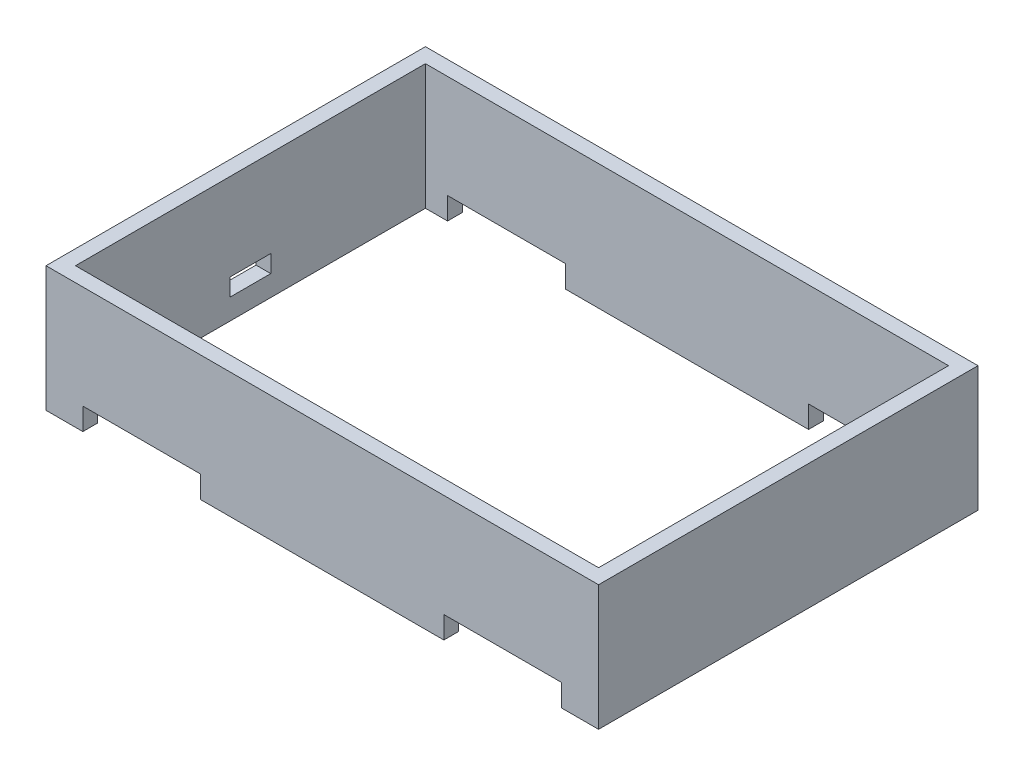
ISO-10303-21;
HEADER;
FILE_DESCRIPTION(('STEP AP214'),'2;1');
FILE_NAME('part.step','',(''),(''),'','','');
FILE_SCHEMA(('AUTOMOTIVE_DESIGN { 1 0 10303 214 1 1 1 1 }'));
ENDSEC;
DATA;
#1=APPLICATION_CONTEXT('core data for automotive mechanical design processes');
#2=APPLICATION_PROTOCOL_DEFINITION('international standard','automotive_design',2000,#1);
#3=PRODUCT_CONTEXT('',#1,'mechanical');
#4=PRODUCT('Part','Part','',(#3));
#5=PRODUCT_RELATED_PRODUCT_CATEGORY('part','',(#4));
#6=PRODUCT_DEFINITION_FORMATION('','',#4);
#7=PRODUCT_DEFINITION_CONTEXT('part definition',#1,'design');
#8=PRODUCT_DEFINITION('design','',#6,#7);
#9=PRODUCT_DEFINITION_SHAPE('','',#8);
#10=(LENGTH_UNIT() NAMED_UNIT(*) SI_UNIT(.MILLI.,.METRE.));
#11=(NAMED_UNIT(*) PLANE_ANGLE_UNIT() SI_UNIT($,.RADIAN.));
#12=(NAMED_UNIT(*) SI_UNIT($,.STERADIAN.) SOLID_ANGLE_UNIT());
#13=UNCERTAINTY_MEASURE_WITH_UNIT(LENGTH_MEASURE(1.E-05),#10,'distance_accuracy_value','');
#14=(GEOMETRIC_REPRESENTATION_CONTEXT(3) GLOBAL_UNCERTAINTY_ASSIGNED_CONTEXT((#13)) GLOBAL_UNIT_ASSIGNED_CONTEXT((#10,
#11,#12)) REPRESENTATION_CONTEXT('',''));
#15=CARTESIAN_POINT('',(0.,0.,0.));
#16=DIRECTION('',(0.,0.,1.));
#17=DIRECTION('',(1.,0.,0.));
#18=AXIS2_PLACEMENT_3D('',#15,#16,#17);
#19=CARTESIAN_POINT('',(0.,0.,0.));
#20=DIRECTION('',(0.,1.,0.));
#21=DIRECTION('',(0.,0.,1.));
#22=AXIS2_PLACEMENT_3D('',#19,#20,#21);
#23=PLANE('',#22);
#24=DIRECTION('',(1.,0.,0.));
#25=VECTOR('',#24,1.);
#26=CARTESIAN_POINT('',(-47.625,0.,32.7025));
#27=LINE('',#26,#25);
#28=CARTESIAN_POINT('',(41.275,0.,32.7025));
#29=VERTEX_POINT('',#28);
#30=CARTESIAN_POINT('',(47.625,0.,32.7025));
#31=VERTEX_POINT('',#30);
#32=EDGE_CURVE('E241',#29,#31,#27,.T.);
#33=ORIENTED_EDGE('',*,*,#32,.F.);
#34=DIRECTION('',(0.,0.,-1.));
#35=VECTOR('',#34,1.);
#36=CARTESIAN_POINT('',(41.275,0.,32.7025));
#37=LINE('',#36,#35);
#38=CARTESIAN_POINT('',(41.275,0.,30.1625));
#39=VERTEX_POINT('',#38);
#40=EDGE_CURVE('E224',#29,#39,#37,.T.);
#41=ORIENTED_EDGE('',*,*,#40,.T.);
#42=DIRECTION('',(-1.,0.,0.));
#43=VECTOR('',#42,1.);
#44=CARTESIAN_POINT('',(45.085,0.,30.1625));
#45=LINE('',#44,#43);
#46=CARTESIAN_POINT('',(45.085,0.,30.1625));
#47=VERTEX_POINT('',#46);
#48=EDGE_CURVE('E281',#47,#39,#45,.T.);
#49=ORIENTED_EDGE('',*,*,#48,.F.);
#50=DIRECTION('',(0.,0.,1.));
#51=VECTOR('',#50,1.);
#52=CARTESIAN_POINT('',(45.085,0.,30.1625));
#53=LINE('',#52,#51);
#54=CARTESIAN_POINT('',(45.085,0.,-30.1625));
#55=VERTEX_POINT('',#54);
#56=EDGE_CURVE('E432',#55,#47,#53,.T.);
#57=ORIENTED_EDGE('',*,*,#56,.F.);
#58=DIRECTION('',(1.,0.,0.));
#59=VECTOR('',#58,1.);
#60=CARTESIAN_POINT('',(45.085,0.,-30.1625));
#61=LINE('',#60,#59);
#62=CARTESIAN_POINT('',(41.275,0.,-30.1625));
#63=VERTEX_POINT('',#62);
#64=EDGE_CURVE('E436',#63,#55,#61,.T.);
#65=ORIENTED_EDGE('',*,*,#64,.F.);
#66=CARTESIAN_POINT('',(41.275,0.,-32.7025));
#67=VERTEX_POINT('',#66);
#68=EDGE_CURVE('E236',#63,#67,#37,.T.);
#69=ORIENTED_EDGE('',*,*,#68,.T.);
#70=DIRECTION('',(-1.,0.,0.));
#71=VECTOR('',#70,1.);
#72=CARTESIAN_POINT('',(-47.625,0.,-32.7025));
#73=LINE('',#72,#71);
#74=CARTESIAN_POINT('',(47.625,0.,-32.7025));
#75=VERTEX_POINT('',#74);
#76=EDGE_CURVE('E261',#75,#67,#73,.T.);
#77=ORIENTED_EDGE('',*,*,#76,.F.);
#78=DIRECTION('',(0.,0.,-1.));
#79=VECTOR('',#78,1.);
#80=CARTESIAN_POINT('',(47.625,0.,-32.7025));
#81=LINE('',#80,#79);
#82=EDGE_CURVE('E252',#31,#75,#81,.T.);
#83=ORIENTED_EDGE('',*,*,#82,.F.);
#84=EDGE_LOOP('',(#33,#41,#49,#57,#65,#69,#77,#83));
#85=FACE_BOUND('',#84,.T.);
#86=ADVANCED_FACE('F38',(#85),#23,.F.);
#87=CARTESIAN_POINT('',(20.955,0.,-32.7025));
#88=VERTEX_POINT('',#87);
#89=CARTESIAN_POINT('',(-20.955,0.,-32.7025));
#90=VERTEX_POINT('',#89);
#91=EDGE_CURVE('E295',#88,#90,#73,.T.);
#92=ORIENTED_EDGE('',*,*,#91,.F.);
#93=DIRECTION('',(0.,0.,-1.));
#94=VECTOR('',#93,1.);
#95=CARTESIAN_POINT('',(20.955,0.,32.7025));
#96=LINE('',#95,#94);
#97=CARTESIAN_POINT('',(20.955,0.,-30.1625));
#98=VERTEX_POINT('',#97);
#99=EDGE_CURVE('E235',#98,#88,#96,.T.);
#100=ORIENTED_EDGE('',*,*,#99,.F.);
#101=CARTESIAN_POINT('',(-20.955,0.,-30.1625));
#102=VERTEX_POINT('',#101);
#103=EDGE_CURVE('E443',#102,#98,#61,.T.);
#104=ORIENTED_EDGE('',*,*,#103,.F.);
#105=DIRECTION('',(0.,0.,-1.));
#106=VECTOR('',#105,1.);
#107=CARTESIAN_POINT('',(-20.955,0.,32.7025));
#108=LINE('',#107,#106);
#109=EDGE_CURVE('E342',#102,#90,#108,.T.);
#110=ORIENTED_EDGE('',*,*,#109,.T.);
#111=EDGE_LOOP('',(#92,#100,#104,#110));
#112=FACE_BOUND('',#111,.T.);
#113=ADVANCED_FACE('F570',(#112),#23,.F.);
#114=CARTESIAN_POINT('',(20.955,0.,30.1625));
#115=VERTEX_POINT('',#114);
#116=CARTESIAN_POINT('',(-20.955,0.,30.1625));
#117=VERTEX_POINT('',#116);
#118=EDGE_CURVE('E486',#115,#117,#45,.T.);
#119=ORIENTED_EDGE('',*,*,#118,.F.);
#120=CARTESIAN_POINT('',(20.955,0.,32.7025));
#121=VERTEX_POINT('',#120);
#122=EDGE_CURVE('E503',#121,#115,#96,.T.);
#123=ORIENTED_EDGE('',*,*,#122,.F.);
#124=CARTESIAN_POINT('',(-20.955,0.,32.7025));
#125=VERTEX_POINT('',#124);
#126=EDGE_CURVE('E254',#125,#121,#27,.T.);
#127=ORIENTED_EDGE('',*,*,#126,.F.);
#128=EDGE_CURVE('E336',#125,#117,#108,.T.);
#129=ORIENTED_EDGE('',*,*,#128,.T.);
#130=EDGE_LOOP('',(#119,#123,#127,#129));
#131=FACE_BOUND('',#130,.T.);
#132=ADVANCED_FACE('F595',(#131),#23,.F.);
#133=CARTESIAN_POINT('',(47.625,21.59,-32.7025));
#134=DIRECTION('',(-1.,0.,0.));
#135=DIRECTION('',(0.,0.,1.));
#136=AXIS2_PLACEMENT_3D('',#133,#134,#135);
#137=PLANE('',#136);
#138=ORIENTED_EDGE('',*,*,#82,.T.);
#139=DIRECTION('',(0.,-1.,0.));
#140=VECTOR('',#139,1.);
#141=CARTESIAN_POINT('',(47.625,21.59,-32.7025));
#142=LINE('',#141,#140);
#143=CARTESIAN_POINT('',(47.625,21.59,-32.7025));
#144=VERTEX_POINT('',#143);
#145=EDGE_CURVE('E318',#144,#75,#142,.T.);
#146=ORIENTED_EDGE('',*,*,#145,.F.);
#147=DIRECTION('',(0.,0.,-1.));
#148=VECTOR('',#147,1.);
#149=CARTESIAN_POINT('',(47.625,21.59,-32.7025));
#150=LINE('',#149,#148);
#151=CARTESIAN_POINT('',(47.625,21.59,32.7025));
#152=VERTEX_POINT('',#151);
#153=EDGE_CURVE('E266',#152,#144,#150,.T.);
#154=ORIENTED_EDGE('',*,*,#153,.F.);
#155=DIRECTION('',(0.,-1.,0.));
#156=VECTOR('',#155,1.);
#157=CARTESIAN_POINT('',(47.625,21.59,32.7025));
#158=LINE('',#157,#156);
#159=EDGE_CURVE('E289',#152,#31,#158,.T.);
#160=ORIENTED_EDGE('',*,*,#159,.T.);
#161=EDGE_LOOP('',(#138,#146,#154,#160));
#162=FACE_BOUND('',#161,.T.);
#163=ADVANCED_FACE('F40',(#162),#137,.F.);
#164=CARTESIAN_POINT('',(-47.625,21.59,-32.7025));
#165=DIRECTION('',(0.,0.,1.));
#166=DIRECTION('',(1.,0.,0.));
#167=AXIS2_PLACEMENT_3D('',#164,#165,#166);
#168=PLANE('',#167);
#169=ORIENTED_EDGE('',*,*,#76,.T.);
#170=DIRECTION('',(0.,1.,0.));
#171=VECTOR('',#170,1.);
#172=CARTESIAN_POINT('',(41.275,21.59,-32.7025));
#173=LINE('',#172,#171);
#174=CARTESIAN_POINT('',(41.275,3.81,-32.7025));
#175=VERTEX_POINT('',#174);
#176=EDGE_CURVE('E385',#67,#175,#173,.T.);
#177=ORIENTED_EDGE('',*,*,#176,.T.);
#178=DIRECTION('',(-1.,0.,0.));
#179=VECTOR('',#178,1.);
#180=CARTESIAN_POINT('',(-47.625,3.81000000000002,-32.7025));
#181=LINE('',#180,#179);
#182=CARTESIAN_POINT('',(20.955,3.81000000000001,-32.7025));
#183=VERTEX_POINT('',#182);
#184=EDGE_CURVE('E377',#175,#183,#181,.T.);
#185=ORIENTED_EDGE('',*,*,#184,.T.);
#186=DIRECTION('',(0.,-1.,0.));
#187=VECTOR('',#186,1.);
#188=CARTESIAN_POINT('',(20.955,21.59,-32.7025));
#189=LINE('',#188,#187);
#190=EDGE_CURVE('E369',#183,#88,#189,.T.);
#191=ORIENTED_EDGE('',*,*,#190,.T.);
#192=ORIENTED_EDGE('',*,*,#91,.T.);
#193=DIRECTION('',(0.,1.,0.));
#194=VECTOR('',#193,1.);
#195=CARTESIAN_POINT('',(-20.955,21.59,-32.7025));
#196=LINE('',#195,#194);
#197=CARTESIAN_POINT('',(-20.955,3.81,-32.7025));
#198=VERTEX_POINT('',#197);
#199=EDGE_CURVE('E361',#90,#198,#196,.T.);
#200=ORIENTED_EDGE('',*,*,#199,.T.);
#201=DIRECTION('',(-1.,0.,0.));
#202=VECTOR('',#201,1.);
#203=CARTESIAN_POINT('',(-47.625,3.81000000000001,-32.7025));
#204=LINE('',#203,#202);
#205=CARTESIAN_POINT('',(-41.275,3.81000000000001,-32.7025));
#206=VERTEX_POINT('',#205);
#207=EDGE_CURVE('E354',#198,#206,#204,.T.);
#208=ORIENTED_EDGE('',*,*,#207,.T.);
#209=DIRECTION('',(0.,-1.,0.));
#210=VECTOR('',#209,1.);
#211=CARTESIAN_POINT('',(-41.275,21.59,-32.7025));
#212=LINE('',#211,#210);
#213=CARTESIAN_POINT('',(-41.275,0.,-32.7025));
#214=VERTEX_POINT('',#213);
#215=EDGE_CURVE('E310',#206,#214,#212,.T.);
#216=ORIENTED_EDGE('',*,*,#215,.T.);
#217=CARTESIAN_POINT('',(-47.625,0.,-32.7025));
#218=VERTEX_POINT('',#217);
#219=EDGE_CURVE('E292',#214,#218,#73,.T.);
#220=ORIENTED_EDGE('',*,*,#219,.T.);
#221=DIRECTION('',(0.,-1.,0.));
#222=VECTOR('',#221,1.);
#223=CARTESIAN_POINT('',(-47.625,21.59,-32.7025));
#224=LINE('',#223,#222);
#225=CARTESIAN_POINT('',(-47.625,21.59,-32.7025));
#226=VERTEX_POINT('',#225);
#227=EDGE_CURVE('E307',#226,#218,#224,.T.);
#228=ORIENTED_EDGE('',*,*,#227,.F.);
#229=DIRECTION('',(-1.,0.,0.));
#230=VECTOR('',#229,1.);
#231=CARTESIAN_POINT('',(-47.625,21.59,-32.7025));
#232=LINE('',#231,#230);
#233=EDGE_CURVE('E272',#144,#226,#232,.T.);
#234=ORIENTED_EDGE('',*,*,#233,.F.);
#235=ORIENTED_EDGE('',*,*,#145,.T.);
#236=EDGE_LOOP('',(#169,#177,#185,#191,#192,#200,#208,#216,#220,#228,#234,#235));
#237=FACE_BOUND('',#236,.T.);
#238=ADVANCED_FACE('F306',(#237),#168,.F.);
#239=CARTESIAN_POINT('',(-47.625,21.59,-32.7025));
#240=DIRECTION('',(1.,0.,0.));
#241=DIRECTION('',(0.,0.,-1.));
#242=AXIS2_PLACEMENT_3D('',#239,#240,#241);
#243=PLANE('',#242);
#244=DIRECTION('',(0.,0.,1.));
#245=VECTOR('',#244,1.);
#246=CARTESIAN_POINT('',(-47.625,3.58,3.50000000000001));
#247=LINE('',#246,#245);
#248=CARTESIAN_POINT('',(-47.625,3.58,-3.49999999999999));
#249=VERTEX_POINT('',#248);
#250=CARTESIAN_POINT('',(-47.625,3.58,3.50000000000001));
#251=VERTEX_POINT('',#250);
#252=EDGE_CURVE('E402',#249,#251,#247,.T.);
#253=ORIENTED_EDGE('',*,*,#252,.F.);
#254=DIRECTION('',(0.,-1.,0.));
#255=VECTOR('',#254,1.);
#256=CARTESIAN_POINT('',(-47.625,3.58,-3.49999999999999));
#257=LINE('',#256,#255);
#258=CARTESIAN_POINT('',(-47.625,6.58,-3.49999999999999));
#259=VERTEX_POINT('',#258);
#260=EDGE_CURVE('E399',#259,#249,#257,.T.);
#261=ORIENTED_EDGE('',*,*,#260,.F.);
#262=DIRECTION('',(0.,0.,-1.));
#263=VECTOR('',#262,1.);
#264=CARTESIAN_POINT('',(-47.625,6.58,3.50000000000001));
#265=LINE('',#264,#263);
#266=CARTESIAN_POINT('',(-47.625,6.58,3.50000000000001));
#267=VERTEX_POINT('',#266);
#268=EDGE_CURVE('E410',#267,#259,#265,.T.);
#269=ORIENTED_EDGE('',*,*,#268,.F.);
#270=DIRECTION('',(0.,1.,0.));
#271=VECTOR('',#270,1.);
#272=CARTESIAN_POINT('',(-47.625,3.58,3.50000000000001));
#273=LINE('',#272,#271);
#274=EDGE_CURVE('E406',#251,#267,#273,.T.);
#275=ORIENTED_EDGE('',*,*,#274,.F.);
#276=EDGE_LOOP('',(#253,#261,#269,#275));
#277=FACE_BOUND('',#276,.T.);
#278=DIRECTION('',(0.,0.,1.));
#279=VECTOR('',#278,1.);
#280=CARTESIAN_POINT('',(-47.625,0.,-32.7025));
#281=LINE('',#280,#279);
#282=CARTESIAN_POINT('',(-47.625,0.,32.7025));
#283=VERTEX_POINT('',#282);
#284=EDGE_CURVE('E255',#218,#283,#281,.T.);
#285=ORIENTED_EDGE('',*,*,#284,.T.);
#286=DIRECTION('',(0.,-1.,0.));
#287=VECTOR('',#286,1.);
#288=CARTESIAN_POINT('',(-47.625,21.59,32.7025));
#289=LINE('',#288,#287);
#290=CARTESIAN_POINT('',(-47.625,21.59,32.7025));
#291=VERTEX_POINT('',#290);
#292=EDGE_CURVE('E319',#291,#283,#289,.T.);
#293=ORIENTED_EDGE('',*,*,#292,.F.);
#294=DIRECTION('',(0.,0.,1.));
#295=VECTOR('',#294,1.);
#296=CARTESIAN_POINT('',(-47.625,21.59,-32.7025));
#297=LINE('',#296,#295);
#298=EDGE_CURVE('E278',#226,#291,#297,.T.);
#299=ORIENTED_EDGE('',*,*,#298,.F.);
#300=ORIENTED_EDGE('',*,*,#227,.T.);
#301=EDGE_LOOP('',(#285,#293,#299,#300));
#302=FACE_BOUND('',#301,.T.);
#303=ADVANCED_FACE('F315',(#277,#302),#243,.F.);
#304=CARTESIAN_POINT('',(-47.625,21.59,32.7025));
#305=DIRECTION('',(0.,0.,-1.));
#306=DIRECTION('',(-1.,0.,0.));
#307=AXIS2_PLACEMENT_3D('',#304,#305,#306);
#308=PLANE('',#307);
#309=DIRECTION('',(1.,0.,0.));
#310=VECTOR('',#309,1.);
#311=CARTESIAN_POINT('',(20.955,3.81000000000001,32.7025));
#312=LINE('',#311,#310);
#313=CARTESIAN_POINT('',(20.955,3.81000000000001,32.7025));
#314=VERTEX_POINT('',#313);
#315=CARTESIAN_POINT('',(41.275,3.81,32.7025));
#316=VERTEX_POINT('',#315);
#317=EDGE_CURVE('E245',#314,#316,#312,.T.);
#318=ORIENTED_EDGE('',*,*,#317,.T.);
#319=DIRECTION('',(0.,-1.,0.));
#320=VECTOR('',#319,1.);
#321=CARTESIAN_POINT('',(41.275,0.,32.7025));
#322=LINE('',#321,#320);
#323=EDGE_CURVE('E228',#316,#29,#322,.T.);
#324=ORIENTED_EDGE('',*,*,#323,.T.);
#325=ORIENTED_EDGE('',*,*,#32,.T.);
#326=ORIENTED_EDGE('',*,*,#159,.F.);
#327=DIRECTION('',(1.,0.,0.));
#328=VECTOR('',#327,1.);
#329=CARTESIAN_POINT('',(-47.625,21.59,32.7025));
#330=LINE('',#329,#328);
#331=EDGE_CURVE('E286',#291,#152,#330,.T.);
#332=ORIENTED_EDGE('',*,*,#331,.F.);
#333=ORIENTED_EDGE('',*,*,#292,.T.);
#334=CARTESIAN_POINT('',(-41.275,0.,32.7025));
#335=VERTEX_POINT('',#334);
#336=EDGE_CURVE('E257',#283,#335,#27,.T.);
#337=ORIENTED_EDGE('',*,*,#336,.T.);
#338=DIRECTION('',(0.,1.,0.));
#339=VECTOR('',#338,1.);
#340=CARTESIAN_POINT('',(-41.275,0.,32.7025));
#341=LINE('',#340,#339);
#342=CARTESIAN_POINT('',(-41.275,3.81000000000001,32.7025));
#343=VERTEX_POINT('',#342);
#344=EDGE_CURVE('E509',#335,#343,#341,.T.);
#345=ORIENTED_EDGE('',*,*,#344,.T.);
#346=DIRECTION('',(1.,0.,0.));
#347=VECTOR('',#346,1.);
#348=CARTESIAN_POINT('',(-41.275,3.81000000000001,32.7025));
#349=LINE('',#348,#347);
#350=CARTESIAN_POINT('',(-20.955,3.81,32.7025));
#351=VERTEX_POINT('',#350);
#352=EDGE_CURVE('E512',#343,#351,#349,.T.);
#353=ORIENTED_EDGE('',*,*,#352,.T.);
#354=DIRECTION('',(0.,-1.,0.));
#355=VECTOR('',#354,1.);
#356=CARTESIAN_POINT('',(-20.955,0.,32.7025));
#357=LINE('',#356,#355);
#358=EDGE_CURVE('E505',#351,#125,#357,.T.);
#359=ORIENTED_EDGE('',*,*,#358,.T.);
#360=ORIENTED_EDGE('',*,*,#126,.T.);
#361=DIRECTION('',(0.,1.,0.));
#362=VECTOR('',#361,1.);
#363=CARTESIAN_POINT('',(20.955,0.,32.7025));
#364=LINE('',#363,#362);
#365=EDGE_CURVE('E247',#121,#314,#364,.T.);
#366=ORIENTED_EDGE('',*,*,#365,.T.);
#367=EDGE_LOOP('',(#318,#324,#325,#326,#332,#333,#337,#345,#353,#359,#360,#366));
#368=FACE_BOUND('',#367,.T.);
#369=ADVANCED_FACE('F239',(#368),#308,.F.);
#370=CARTESIAN_POINT('',(0.,21.59,0.));
#371=DIRECTION('',(0.,1.,0.));
#372=DIRECTION('',(0.,0.,1.));
#373=AXIS2_PLACEMENT_3D('',#370,#371,#372);
#374=PLANE('',#373);
#375=DIRECTION('',(0.,0.,1.));
#376=VECTOR('',#375,1.);
#377=CARTESIAN_POINT('',(-45.085,21.59,30.1625));
#378=LINE('',#377,#376);
#379=CARTESIAN_POINT('',(-45.085,21.59,-30.1625));
#380=VERTEX_POINT('',#379);
#381=CARTESIAN_POINT('',(-45.085,21.59,30.1625));
#382=VERTEX_POINT('',#381);
#383=EDGE_CURVE('E431',#380,#382,#378,.T.);
#384=ORIENTED_EDGE('',*,*,#383,.F.);
#385=DIRECTION('',(-1.,0.,0.));
#386=VECTOR('',#385,1.);
#387=CARTESIAN_POINT('',(45.085,21.59,-30.1625));
#388=LINE('',#387,#386);
#389=CARTESIAN_POINT('',(45.085,21.59,-30.1625));
#390=VERTEX_POINT('',#389);
#391=EDGE_CURVE('E456',#390,#380,#388,.T.);
#392=ORIENTED_EDGE('',*,*,#391,.F.);
#393=DIRECTION('',(0.,0.,-1.));
#394=VECTOR('',#393,1.);
#395=CARTESIAN_POINT('',(45.085,21.59,30.1625));
#396=LINE('',#395,#394);
#397=CARTESIAN_POINT('',(45.085,21.59,30.1625));
#398=VERTEX_POINT('',#397);
#399=EDGE_CURVE('E452',#398,#390,#396,.T.);
#400=ORIENTED_EDGE('',*,*,#399,.F.);
#401=DIRECTION('',(1.,0.,0.));
#402=VECTOR('',#401,1.);
#403=CARTESIAN_POINT('',(45.085,21.59,30.1625));
#404=LINE('',#403,#402);
#405=EDGE_CURVE('E448',#382,#398,#404,.T.);
#406=ORIENTED_EDGE('',*,*,#405,.F.);
#407=EDGE_LOOP('',(#384,#392,#400,#406));
#408=FACE_BOUND('',#407,.T.);
#409=ORIENTED_EDGE('',*,*,#153,.T.);
#410=ORIENTED_EDGE('',*,*,#233,.T.);
#411=ORIENTED_EDGE('',*,*,#298,.T.);
#412=ORIENTED_EDGE('',*,*,#331,.T.);
#413=EDGE_LOOP('',(#409,#410,#411,#412));
#414=FACE_BOUND('',#413,.T.);
#415=ADVANCED_FACE('F478',(#408,#414),#374,.T.);
#416=ORIENTED_EDGE('',*,*,#219,.F.);
#417=DIRECTION('',(0.,0.,-1.));
#418=VECTOR('',#417,1.);
#419=CARTESIAN_POINT('',(-41.275,0.,32.7025));
#420=LINE('',#419,#418);
#421=CARTESIAN_POINT('',(-41.275,0.,-30.1625));
#422=VERTEX_POINT('',#421);
#423=EDGE_CURVE('E330',#422,#214,#420,.T.);
#424=ORIENTED_EDGE('',*,*,#423,.F.);
#425=CARTESIAN_POINT('',(-45.085,0.,-30.1625));
#426=VERTEX_POINT('',#425);
#427=EDGE_CURVE('E438',#426,#422,#61,.T.);
#428=ORIENTED_EDGE('',*,*,#427,.F.);
#429=DIRECTION('',(0.,0.,-1.));
#430=VECTOR('',#429,1.);
#431=CARTESIAN_POINT('',(-45.085,0.,30.1625));
#432=LINE('',#431,#430);
#433=CARTESIAN_POINT('',(-45.085,0.,30.1625));
#434=VERTEX_POINT('',#433);
#435=EDGE_CURVE('E442',#434,#426,#432,.T.);
#436=ORIENTED_EDGE('',*,*,#435,.F.);
#437=CARTESIAN_POINT('',(-41.275,0.,30.1625));
#438=VERTEX_POINT('',#437);
#439=EDGE_CURVE('E326',#438,#434,#45,.T.);
#440=ORIENTED_EDGE('',*,*,#439,.F.);
#441=EDGE_CURVE('E324',#335,#438,#420,.T.);
#442=ORIENTED_EDGE('',*,*,#441,.F.);
#443=ORIENTED_EDGE('',*,*,#336,.F.);
#444=ORIENTED_EDGE('',*,*,#284,.F.);
#445=EDGE_LOOP('',(#416,#424,#428,#436,#440,#442,#443,#444));
#446=FACE_BOUND('',#445,.T.);
#447=ADVANCED_FACE('F321',(#446),#23,.F.);
#448=CARTESIAN_POINT('',(-45.085,-108.48840733,30.1625));
#449=DIRECTION('',(-1.,0.,0.));
#450=DIRECTION('',(0.,0.,1.));
#451=AXIS2_PLACEMENT_3D('',#448,#449,#450);
#452=PLANE('',#451);
#453=DIRECTION('',(0.,0.,1.));
#454=VECTOR('',#453,1.);
#455=CARTESIAN_POINT('',(-45.085,6.58,3.49999999999998));
#456=LINE('',#455,#454);
#457=CARTESIAN_POINT('',(-45.085,6.58,-3.49999999999999));
#458=VERTEX_POINT('',#457);
#459=CARTESIAN_POINT('',(-45.085,6.58,3.50000000000001));
#460=VERTEX_POINT('',#459);
#461=EDGE_CURVE('E391',#458,#460,#456,.T.);
#462=ORIENTED_EDGE('',*,*,#461,.F.);
#463=DIRECTION('',(0.,1.,0.));
#464=VECTOR('',#463,1.);
#465=CARTESIAN_POINT('',(-45.085,3.58,-3.49999999999999));
#466=LINE('',#465,#464);
#467=CARTESIAN_POINT('',(-45.085,3.58,-3.5));
#468=VERTEX_POINT('',#467);
#469=EDGE_CURVE('E395',#468,#458,#466,.T.);
#470=ORIENTED_EDGE('',*,*,#469,.F.);
#471=DIRECTION('',(0.,0.,-1.));
#472=VECTOR('',#471,1.);
#473=CARTESIAN_POINT('',(-45.085,3.58,3.49999999999998));
#474=LINE('',#473,#472);
#475=CARTESIAN_POINT('',(-45.085,3.58,3.50000000000001));
#476=VERTEX_POINT('',#475);
#477=EDGE_CURVE('E418',#476,#468,#474,.T.);
#478=ORIENTED_EDGE('',*,*,#477,.F.);
#479=DIRECTION('',(0.,-1.,0.));
#480=VECTOR('',#479,1.);
#481=CARTESIAN_POINT('',(-45.085,3.58,3.50000000000001));
#482=LINE('',#481,#480);
#483=EDGE_CURVE('E388',#460,#476,#482,.T.);
#484=ORIENTED_EDGE('',*,*,#483,.F.);
#485=EDGE_LOOP('',(#462,#470,#478,#484));
#486=FACE_BOUND('',#485,.T.);
#487=ORIENTED_EDGE('',*,*,#435,.T.);
#488=DIRECTION('',(0.,1.,0.));
#489=VECTOR('',#488,1.);
#490=CARTESIAN_POINT('',(-45.085,-108.48840733,-30.1625));
#491=LINE('',#490,#489);
#492=EDGE_CURVE('E437',#426,#380,#491,.T.);
#493=ORIENTED_EDGE('',*,*,#492,.T.);
#494=ORIENTED_EDGE('',*,*,#383,.T.);
#495=DIRECTION('',(0.,1.,0.));
#496=VECTOR('',#495,1.);
#497=CARTESIAN_POINT('',(-45.085,-108.48840733,30.1625));
#498=LINE('',#497,#496);
#499=EDGE_CURVE('E460',#434,#382,#498,.T.);
#500=ORIENTED_EDGE('',*,*,#499,.F.);
#501=EDGE_LOOP('',(#487,#493,#494,#500));
#502=FACE_BOUND('',#501,.T.);
#503=ADVANCED_FACE('F599',(#486,#502),#452,.F.);
#504=CARTESIAN_POINT('',(45.085,-108.48840733,-30.1625));
#505=DIRECTION('',(0.,0.,-1.));
#506=DIRECTION('',(-1.,0.,0.));
#507=AXIS2_PLACEMENT_3D('',#504,#505,#506);
#508=PLANE('',#507);
#509=DIRECTION('',(1.,0.,0.));
#510=VECTOR('',#509,1.);
#511=CARTESIAN_POINT('',(45.085,3.81000000000001,-30.1625));
#512=LINE('',#511,#510);
#513=CARTESIAN_POINT('',(20.955,3.81000000000001,-30.1625));
#514=VERTEX_POINT('',#513);
#515=CARTESIAN_POINT('',(41.275,3.81,-30.1625));
#516=VERTEX_POINT('',#515);
#517=EDGE_CURVE('E373',#514,#516,#512,.T.);
#518=ORIENTED_EDGE('',*,*,#517,.T.);
#519=DIRECTION('',(0.,-1.,0.));
#520=VECTOR('',#519,1.);
#521=CARTESIAN_POINT('',(41.275,-108.48840733,-30.1625));
#522=LINE('',#521,#520);
#523=EDGE_CURVE('E381',#516,#63,#522,.T.);
#524=ORIENTED_EDGE('',*,*,#523,.T.);
#525=ORIENTED_EDGE('',*,*,#64,.T.);
#526=DIRECTION('',(0.,1.,0.));
#527=VECTOR('',#526,1.);
#528=CARTESIAN_POINT('',(45.085,-108.48840733,-30.1625));
#529=LINE('',#528,#527);
#530=EDGE_CURVE('E463',#55,#390,#529,.T.);
#531=ORIENTED_EDGE('',*,*,#530,.T.);
#532=ORIENTED_EDGE('',*,*,#391,.T.);
#533=ORIENTED_EDGE('',*,*,#492,.F.);
#534=ORIENTED_EDGE('',*,*,#427,.T.);
#535=DIRECTION('',(0.,1.,0.));
#536=VECTOR('',#535,1.);
#537=CARTESIAN_POINT('',(-41.275,-108.48840733,-30.1625));
#538=LINE('',#537,#536);
#539=CARTESIAN_POINT('',(-41.275,3.81000000000001,-30.1625));
#540=VERTEX_POINT('',#539);
#541=EDGE_CURVE('E343',#422,#540,#538,.T.);
#542=ORIENTED_EDGE('',*,*,#541,.T.);
#543=DIRECTION('',(1.,0.,0.));
#544=VECTOR('',#543,1.);
#545=CARTESIAN_POINT('',(45.085,3.80999999999999,-30.1625));
#546=LINE('',#545,#544);
#547=CARTESIAN_POINT('',(-20.955,3.81,-30.1625));
#548=VERTEX_POINT('',#547);
#549=EDGE_CURVE('E350',#540,#548,#546,.T.);
#550=ORIENTED_EDGE('',*,*,#549,.T.);
#551=DIRECTION('',(0.,-1.,0.));
#552=VECTOR('',#551,1.);
#553=CARTESIAN_POINT('',(-20.955,-108.48840733,-30.1625));
#554=LINE('',#553,#552);
#555=EDGE_CURVE('E357',#548,#102,#554,.T.);
#556=ORIENTED_EDGE('',*,*,#555,.T.);
#557=ORIENTED_EDGE('',*,*,#103,.T.);
#558=DIRECTION('',(0.,1.,0.));
#559=VECTOR('',#558,1.);
#560=CARTESIAN_POINT('',(20.955,-108.48840733,-30.1625));
#561=LINE('',#560,#559);
#562=EDGE_CURVE('E365',#98,#514,#561,.T.);
#563=ORIENTED_EDGE('',*,*,#562,.T.);
#564=EDGE_LOOP('',(#518,#524,#525,#531,#532,#533,#534,#542,#550,#556,#557,#563));
#565=FACE_BOUND('',#564,.T.);
#566=ADVANCED_FACE('F495',(#565),#508,.F.);
#567=CARTESIAN_POINT('',(45.085,-108.48840733,30.1625));
#568=DIRECTION('',(1.,0.,0.));
#569=DIRECTION('',(0.,0.,-1.));
#570=AXIS2_PLACEMENT_3D('',#567,#568,#569);
#571=PLANE('',#570);
#572=ORIENTED_EDGE('',*,*,#56,.T.);
#573=DIRECTION('',(0.,1.,0.));
#574=VECTOR('',#573,1.);
#575=CARTESIAN_POINT('',(45.085,-108.48840733,30.1625));
#576=LINE('',#575,#574);
#577=EDGE_CURVE('E466',#47,#398,#576,.T.);
#578=ORIENTED_EDGE('',*,*,#577,.T.);
#579=ORIENTED_EDGE('',*,*,#399,.T.);
#580=ORIENTED_EDGE('',*,*,#530,.F.);
#581=EDGE_LOOP('',(#572,#578,#579,#580));
#582=FACE_BOUND('',#581,.T.);
#583=ADVANCED_FACE('F482',(#582),#571,.F.);
#584=CARTESIAN_POINT('',(45.085,-108.48840733,30.1625));
#585=DIRECTION('',(0.,0.,1.));
#586=DIRECTION('',(1.,0.,0.));
#587=AXIS2_PLACEMENT_3D('',#584,#585,#586);
#588=PLANE('',#587);
#589=ORIENTED_EDGE('',*,*,#48,.T.);
#590=DIRECTION('',(0.,1.,0.));
#591=VECTOR('',#590,1.);
#592=CARTESIAN_POINT('',(41.275,-108.48840733,30.1625));
#593=LINE('',#592,#591);
#594=CARTESIAN_POINT('',(41.275,3.81,30.1625));
#595=VERTEX_POINT('',#594);
#596=EDGE_CURVE('E11',#39,#595,#593,.T.);
#597=ORIENTED_EDGE('',*,*,#596,.T.);
#598=DIRECTION('',(-1.,0.,0.));
#599=VECTOR('',#598,1.);
#600=CARTESIAN_POINT('',(45.085,3.81000000000001,30.1625));
#601=LINE('',#600,#599);
#602=CARTESIAN_POINT('',(20.955,3.81000000000001,30.1625));
#603=VERTEX_POINT('',#602);
#604=EDGE_CURVE('E47',#595,#603,#601,.T.);
#605=ORIENTED_EDGE('',*,*,#604,.T.);
#606=DIRECTION('',(0.,-1.,0.));
#607=VECTOR('',#606,1.);
#608=CARTESIAN_POINT('',(20.955,-108.48840733,30.1625));
#609=LINE('',#608,#607);
#610=EDGE_CURVE('E538',#603,#115,#609,.T.);
#611=ORIENTED_EDGE('',*,*,#610,.T.);
#612=ORIENTED_EDGE('',*,*,#118,.T.);
#613=DIRECTION('',(0.,1.,0.));
#614=VECTOR('',#613,1.);
#615=CARTESIAN_POINT('',(-20.955,-108.48840733,30.1625));
#616=LINE('',#615,#614);
#617=CARTESIAN_POINT('',(-20.955,3.81,30.1625));
#618=VERTEX_POINT('',#617);
#619=EDGE_CURVE('E533',#117,#618,#616,.T.);
#620=ORIENTED_EDGE('',*,*,#619,.T.);
#621=DIRECTION('',(-1.,0.,0.));
#622=VECTOR('',#621,1.);
#623=CARTESIAN_POINT('',(45.085,3.80999999999999,30.1625));
#624=LINE('',#623,#622);
#625=CARTESIAN_POINT('',(-41.275,3.81000000000001,30.1625));
#626=VERTEX_POINT('',#625);
#627=EDGE_CURVE('E531',#618,#626,#624,.T.);
#628=ORIENTED_EDGE('',*,*,#627,.T.);
#629=DIRECTION('',(0.,-1.,0.));
#630=VECTOR('',#629,1.);
#631=CARTESIAN_POINT('',(-41.275,-108.48840733,30.1625));
#632=LINE('',#631,#630);
#633=EDGE_CURVE('E532',#626,#438,#632,.T.);
#634=ORIENTED_EDGE('',*,*,#633,.T.);
#635=ORIENTED_EDGE('',*,*,#439,.T.);
#636=ORIENTED_EDGE('',*,*,#499,.T.);
#637=ORIENTED_EDGE('',*,*,#405,.T.);
#638=ORIENTED_EDGE('',*,*,#577,.F.);
#639=EDGE_LOOP('',(#589,#597,#605,#611,#612,#620,#628,#634,#635,#636,#637,#638));
#640=FACE_BOUND('',#639,.T.);
#641=ADVANCED_FACE('F473',(#640),#588,.F.);
#642=CARTESIAN_POINT('',(47.626,3.58,-3.5));
#643=DIRECTION('',(0.,0.,-1.));
#644=DIRECTION('',(-1.,0.,0.));
#645=AXIS2_PLACEMENT_3D('',#642,#643,#644);
#646=PLANE('',#645);
#647=ORIENTED_EDGE('',*,*,#469,.T.);
#648=DIRECTION('',(-1.,0.,0.));
#649=VECTOR('',#648,1.);
#650=CARTESIAN_POINT('',(47.626,6.58,-3.5));
#651=LINE('',#650,#649);
#652=EDGE_CURVE('E415',#458,#259,#651,.T.);
#653=ORIENTED_EDGE('',*,*,#652,.T.);
#654=ORIENTED_EDGE('',*,*,#260,.T.);
#655=DIRECTION('',(-1.,0.,0.));
#656=VECTOR('',#655,1.);
#657=CARTESIAN_POINT('',(47.626,3.58,-3.5));
#658=LINE('',#657,#656);
#659=EDGE_CURVE('E414',#468,#249,#658,.T.);
#660=ORIENTED_EDGE('',*,*,#659,.F.);
#661=EDGE_LOOP('',(#647,#653,#654,#660));
#662=FACE_BOUND('',#661,.T.);
#663=ADVANCED_FACE('F628',(#662),#646,.F.);
#664=CARTESIAN_POINT('',(47.626,6.58,3.5));
#665=DIRECTION('',(0.,1.,0.));
#666=DIRECTION('',(0.,0.,1.));
#667=AXIS2_PLACEMENT_3D('',#664,#665,#666);
#668=PLANE('',#667);
#669=ORIENTED_EDGE('',*,*,#461,.T.);
#670=DIRECTION('',(-1.,0.,0.));
#671=VECTOR('',#670,1.);
#672=CARTESIAN_POINT('',(47.626,6.58,3.5));
#673=LINE('',#672,#671);
#674=EDGE_CURVE('E419',#460,#267,#673,.T.);
#675=ORIENTED_EDGE('',*,*,#674,.T.);
#676=ORIENTED_EDGE('',*,*,#268,.T.);
#677=ORIENTED_EDGE('',*,*,#652,.F.);
#678=EDGE_LOOP('',(#669,#675,#676,#677));
#679=FACE_BOUND('',#678,.T.);
#680=ADVANCED_FACE('F625',(#679),#668,.F.);
#681=CARTESIAN_POINT('',(47.626,3.58,3.5));
#682=DIRECTION('',(0.,0.,1.));
#683=DIRECTION('',(1.,0.,0.));
#684=AXIS2_PLACEMENT_3D('',#681,#682,#683);
#685=PLANE('',#684);
#686=ORIENTED_EDGE('',*,*,#483,.T.);
#687=DIRECTION('',(-1.,0.,0.));
#688=VECTOR('',#687,1.);
#689=CARTESIAN_POINT('',(47.626,3.58,3.5));
#690=LINE('',#689,#688);
#691=EDGE_CURVE('E422',#476,#251,#690,.T.);
#692=ORIENTED_EDGE('',*,*,#691,.T.);
#693=ORIENTED_EDGE('',*,*,#274,.T.);
#694=ORIENTED_EDGE('',*,*,#674,.F.);
#695=EDGE_LOOP('',(#686,#692,#693,#694));
#696=FACE_BOUND('',#695,.T.);
#697=ADVANCED_FACE('F621',(#696),#685,.F.);
#698=CARTESIAN_POINT('',(47.626,3.58,3.5));
#699=DIRECTION('',(0.,-1.,0.));
#700=DIRECTION('',(0.,0.,-1.));
#701=AXIS2_PLACEMENT_3D('',#698,#699,#700);
#702=PLANE('',#701);
#703=ORIENTED_EDGE('',*,*,#477,.T.);
#704=ORIENTED_EDGE('',*,*,#659,.T.);
#705=ORIENTED_EDGE('',*,*,#252,.T.);
#706=ORIENTED_EDGE('',*,*,#691,.F.);
#707=EDGE_LOOP('',(#703,#704,#705,#706));
#708=FACE_BOUND('',#707,.T.);
#709=ADVANCED_FACE('F617',(#708),#702,.F.);
#710=CARTESIAN_POINT('',(-41.275,0.,32.7025));
#711=DIRECTION('',(-1.,0.,0.));
#712=DIRECTION('',(0.,0.,1.));
#713=AXIS2_PLACEMENT_3D('',#710,#711,#712);
#714=PLANE('',#713);
#715=DIRECTION('',(0.,0.,-1.));
#716=VECTOR('',#715,1.);
#717=CARTESIAN_POINT('',(-41.275,3.81000000000001,32.7025));
#718=LINE('',#717,#716);
#719=EDGE_CURVE('E334',#343,#626,#718,.T.);
#720=ORIENTED_EDGE('',*,*,#719,.F.);
#721=ORIENTED_EDGE('',*,*,#344,.F.);
#722=ORIENTED_EDGE('',*,*,#441,.T.);
#723=ORIENTED_EDGE('',*,*,#633,.F.);
#724=EDGE_LOOP('',(#720,#721,#722,#723));
#725=FACE_BOUND('',#724,.T.);
#726=ADVANCED_FACE('F584',(#725),#714,.F.);
#727=CARTESIAN_POINT('',(-41.275,3.81000000000001,32.7025));
#728=DIRECTION('',(0.,1.,0.));
#729=DIRECTION('',(-1.,0.,0.));
#730=AXIS2_PLACEMENT_3D('',#727,#728,#729);
#731=PLANE('',#730);
#732=DIRECTION('',(0.,0.,-1.));
#733=VECTOR('',#732,1.);
#734=CARTESIAN_POINT('',(-20.955,3.81,32.7025));
#735=LINE('',#734,#733);
#736=EDGE_CURVE('E248',#351,#618,#735,.T.);
#737=ORIENTED_EDGE('',*,*,#736,.F.);
#738=ORIENTED_EDGE('',*,*,#352,.F.);
#739=ORIENTED_EDGE('',*,*,#719,.T.);
#740=ORIENTED_EDGE('',*,*,#627,.F.);
#741=EDGE_LOOP('',(#737,#738,#739,#740));
#742=FACE_BOUND('',#741,.T.);
#743=ADVANCED_FACE('F530',(#742),#731,.F.);
#744=CARTESIAN_POINT('',(-20.955,0.,32.7025));
#745=DIRECTION('',(1.,0.,0.));
#746=DIRECTION('',(0.,0.,-1.));
#747=AXIS2_PLACEMENT_3D('',#744,#745,#746);
#748=PLANE('',#747);
#749=ORIENTED_EDGE('',*,*,#128,.F.);
#750=ORIENTED_EDGE('',*,*,#358,.F.);
#751=ORIENTED_EDGE('',*,*,#736,.T.);
#752=ORIENTED_EDGE('',*,*,#619,.F.);
#753=EDGE_LOOP('',(#749,#750,#751,#752));
#754=FACE_BOUND('',#753,.T.);
#755=ADVANCED_FACE('F586',(#754),#748,.F.);
#756=CARTESIAN_POINT('',(20.955,0.,32.7025));
#757=DIRECTION('',(-1.,0.,0.));
#758=DIRECTION('',(0.,0.,1.));
#759=AXIS2_PLACEMENT_3D('',#756,#757,#758);
#760=PLANE('',#759);
#761=DIRECTION('',(0.,0.,-1.));
#762=VECTOR('',#761,1.);
#763=CARTESIAN_POINT('',(20.955,3.81000000000001,32.7025));
#764=LINE('',#763,#762);
#765=EDGE_CURVE('E550',#314,#603,#764,.T.);
#766=ORIENTED_EDGE('',*,*,#765,.F.);
#767=ORIENTED_EDGE('',*,*,#365,.F.);
#768=ORIENTED_EDGE('',*,*,#122,.T.);
#769=ORIENTED_EDGE('',*,*,#610,.F.);
#770=EDGE_LOOP('',(#766,#767,#768,#769));
#771=FACE_BOUND('',#770,.T.);
#772=ADVANCED_FACE('F662',(#771),#760,.F.);
#773=CARTESIAN_POINT('',(20.955,3.81000000000001,32.7025));
#774=DIRECTION('',(0.,1.,0.));
#775=DIRECTION('',(-1.,0.,0.));
#776=AXIS2_PLACEMENT_3D('',#773,#774,#775);
#777=PLANE('',#776);
#778=DIRECTION('',(0.,0.,-1.));
#779=VECTOR('',#778,1.);
#780=CARTESIAN_POINT('',(41.275,3.81,32.7025));
#781=LINE('',#780,#779);
#782=EDGE_CURVE('E347',#316,#595,#781,.T.);
#783=ORIENTED_EDGE('',*,*,#782,.F.);
#784=ORIENTED_EDGE('',*,*,#317,.F.);
#785=ORIENTED_EDGE('',*,*,#765,.T.);
#786=ORIENTED_EDGE('',*,*,#604,.F.);
#787=EDGE_LOOP('',(#783,#784,#785,#786));
#788=FACE_BOUND('',#787,.T.);
#789=ADVANCED_FACE('F549',(#788),#777,.F.);
#790=CARTESIAN_POINT('',(41.275,0.,32.7025));
#791=DIRECTION('',(1.,0.,0.));
#792=DIRECTION('',(0.,0.,-1.));
#793=AXIS2_PLACEMENT_3D('',#790,#791,#792);
#794=PLANE('',#793);
#795=ORIENTED_EDGE('',*,*,#40,.F.);
#796=ORIENTED_EDGE('',*,*,#323,.F.);
#797=ORIENTED_EDGE('',*,*,#782,.T.);
#798=ORIENTED_EDGE('',*,*,#596,.F.);
#799=EDGE_LOOP('',(#795,#796,#797,#798));
#800=FACE_BOUND('',#799,.T.);
#801=ADVANCED_FACE('F226',(#800),#794,.F.);
#802=ORIENTED_EDGE('',*,*,#109,.F.);
#803=ORIENTED_EDGE('',*,*,#555,.F.);
#804=EDGE_CURVE('E517',#548,#198,#735,.T.);
#805=ORIENTED_EDGE('',*,*,#804,.T.);
#806=ORIENTED_EDGE('',*,*,#199,.F.);
#807=EDGE_LOOP('',(#802,#803,#805,#806));
#808=FACE_BOUND('',#807,.T.);
#809=ADVANCED_FACE('F572',(#808),#748,.F.);
#810=ORIENTED_EDGE('',*,*,#804,.F.);
#811=ORIENTED_EDGE('',*,*,#549,.F.);
#812=EDGE_CURVE('E62',#540,#206,#718,.T.);
#813=ORIENTED_EDGE('',*,*,#812,.T.);
#814=ORIENTED_EDGE('',*,*,#207,.F.);
#815=EDGE_LOOP('',(#810,#811,#813,#814));
#816=FACE_BOUND('',#815,.T.);
#817=ADVANCED_FACE('F574',(#816),#731,.F.);
#818=ORIENTED_EDGE('',*,*,#812,.F.);
#819=ORIENTED_EDGE('',*,*,#541,.F.);
#820=ORIENTED_EDGE('',*,*,#423,.T.);
#821=ORIENTED_EDGE('',*,*,#215,.F.);
#822=EDGE_LOOP('',(#818,#819,#820,#821));
#823=FACE_BOUND('',#822,.T.);
#824=ADVANCED_FACE('F576',(#823),#714,.F.);
#825=ORIENTED_EDGE('',*,*,#68,.F.);
#826=ORIENTED_EDGE('',*,*,#523,.F.);
#827=EDGE_CURVE('E552',#516,#175,#781,.T.);
#828=ORIENTED_EDGE('',*,*,#827,.T.);
#829=ORIENTED_EDGE('',*,*,#176,.F.);
#830=EDGE_LOOP('',(#825,#826,#828,#829));
#831=FACE_BOUND('',#830,.T.);
#832=ADVANCED_FACE('F582',(#831),#794,.F.);
#833=ORIENTED_EDGE('',*,*,#827,.F.);
#834=ORIENTED_EDGE('',*,*,#517,.F.);
#835=EDGE_CURVE('E54',#514,#183,#764,.T.);
#836=ORIENTED_EDGE('',*,*,#835,.T.);
#837=ORIENTED_EDGE('',*,*,#184,.F.);
#838=EDGE_LOOP('',(#833,#834,#836,#837));
#839=FACE_BOUND('',#838,.T.);
#840=ADVANCED_FACE('F679',(#839),#777,.F.);
#841=ORIENTED_EDGE('',*,*,#835,.F.);
#842=ORIENTED_EDGE('',*,*,#562,.F.);
#843=ORIENTED_EDGE('',*,*,#99,.T.);
#844=ORIENTED_EDGE('',*,*,#190,.F.);
#845=EDGE_LOOP('',(#841,#842,#843,#844));
#846=FACE_BOUND('',#845,.T.);
#847=ADVANCED_FACE('F565',(#846),#760,.F.);
#848=CLOSED_SHELL('',(#86,#113,#132,#163,#238,#303,#369,#415,#447,#503,#566,#583,#641,#663,#680,
#697,#709,#726,#743,#755,#772,#789,#801,#809,#817,#824,#832,#840,#847));
#849=MANIFOLD_SOLID_BREP('B2',#848);
#850=ADVANCED_BREP_SHAPE_REPRESENTATION('',(#18,#849),#14);
#851=SHAPE_DEFINITION_REPRESENTATION(#9,#850);
ENDSEC;
END-ISO-10303-21;
